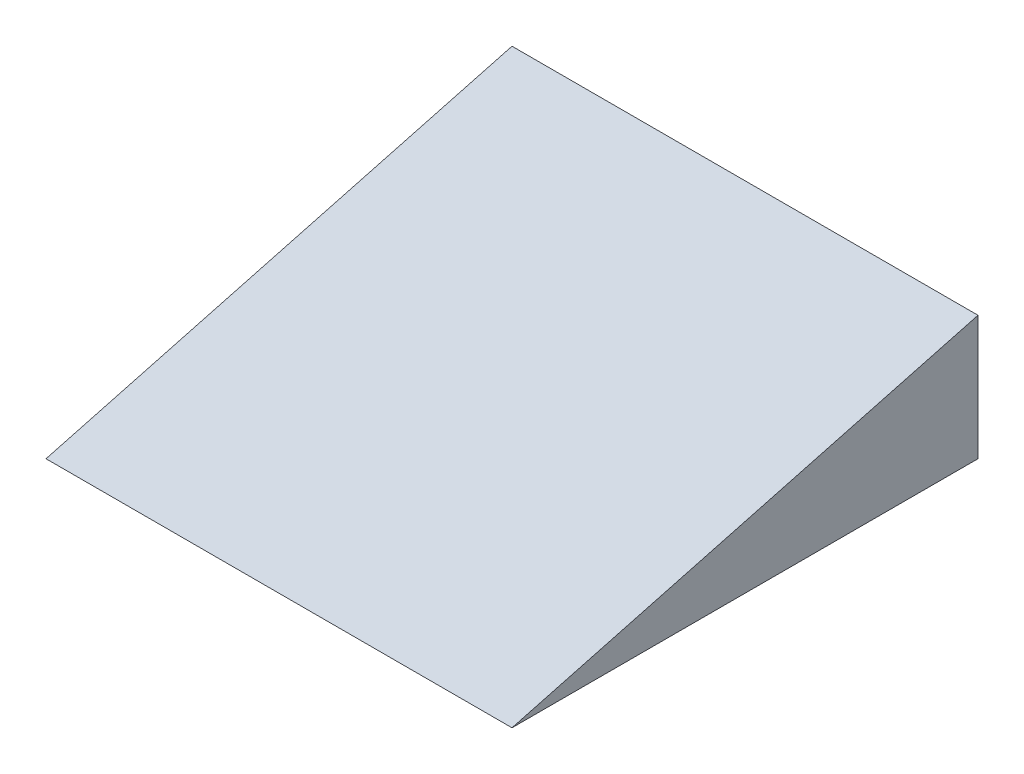
ISO-10303-21;
HEADER;
FILE_DESCRIPTION(('STEP AP214'),'2;1');
FILE_NAME('part.step','',(''),(''),'','','');
FILE_SCHEMA(('AUTOMOTIVE_DESIGN { 1 0 10303 214 1 1 1 1 }'));
ENDSEC;
DATA;
#1=APPLICATION_CONTEXT('core data for automotive mechanical design processes');
#2=APPLICATION_PROTOCOL_DEFINITION('international standard','automotive_design',2000,#1);
#3=PRODUCT_CONTEXT('',#1,'mechanical');
#4=PRODUCT('Part','Part','',(#3));
#5=PRODUCT_RELATED_PRODUCT_CATEGORY('part','',(#4));
#6=PRODUCT_DEFINITION_FORMATION('','',#4);
#7=PRODUCT_DEFINITION_CONTEXT('part definition',#1,'design');
#8=PRODUCT_DEFINITION('design','',#6,#7);
#9=PRODUCT_DEFINITION_SHAPE('','',#8);
#10=(LENGTH_UNIT() NAMED_UNIT(*) SI_UNIT(.MILLI.,.METRE.));
#11=(NAMED_UNIT(*) PLANE_ANGLE_UNIT() SI_UNIT($,.RADIAN.));
#12=(NAMED_UNIT(*) SI_UNIT($,.STERADIAN.) SOLID_ANGLE_UNIT());
#13=UNCERTAINTY_MEASURE_WITH_UNIT(LENGTH_MEASURE(1.E-05),#10,'distance_accuracy_value','');
#14=(GEOMETRIC_REPRESENTATION_CONTEXT(3) GLOBAL_UNCERTAINTY_ASSIGNED_CONTEXT((#13)) GLOBAL_UNIT_ASSIGNED_CONTEXT((#10,
#11,#12)) REPRESENTATION_CONTEXT('',''));
#15=CARTESIAN_POINT('',(0.,0.,0.));
#16=DIRECTION('',(0.,0.,1.));
#17=DIRECTION('',(1.,0.,0.));
#18=AXIS2_PLACEMENT_3D('',#15,#16,#17);
#19=CARTESIAN_POINT('',(1500.,400.,-1500.));
#20=DIRECTION('',(0.,-0.966234939601246,-0.257662650560332));
#21=DIRECTION('',(0.,0.257662650560332,-0.966234939601246));
#22=AXIS2_PLACEMENT_3D('',#19,#20,#21);
#23=PLANE('',#22);
#24=DIRECTION('',(0.,-0.257662650560332,0.966234939601246));
#25=VECTOR('',#24,1.);
#26=CARTESIAN_POINT('',(0.,400.,-1500.));
#27=LINE('',#26,#25);
#28=CARTESIAN_POINT('',(0.,400.,-1500.));
#29=VERTEX_POINT('',#28);
#30=CARTESIAN_POINT('',(0.,0.,0.));
#31=VERTEX_POINT('',#30);
#32=EDGE_CURVE('E86',#29,#31,#27,.T.);
#33=ORIENTED_EDGE('',*,*,#32,.T.);
#34=DIRECTION('',(-1.,0.,0.));
#35=VECTOR('',#34,1.);
#36=CARTESIAN_POINT('',(1500.,0.,0.));
#37=LINE('',#36,#35);
#38=CARTESIAN_POINT('',(1500.,0.,0.));
#39=VERTEX_POINT('',#38);
#40=EDGE_CURVE('E11',#39,#31,#37,.T.);
#41=ORIENTED_EDGE('',*,*,#40,.F.);
#42=DIRECTION('',(0.,-0.257662650560332,0.966234939601246));
#43=VECTOR('',#42,1.);
#44=CARTESIAN_POINT('',(1500.,400.,-1500.));
#45=LINE('',#44,#43);
#46=CARTESIAN_POINT('',(1500.,400.,-1500.));
#47=VERTEX_POINT('',#46);
#48=EDGE_CURVE('E82',#47,#39,#45,.T.);
#49=ORIENTED_EDGE('',*,*,#48,.F.);
#50=DIRECTION('',(-1.,0.,0.));
#51=VECTOR('',#50,1.);
#52=CARTESIAN_POINT('',(1500.,400.,-1500.));
#53=LINE('',#52,#51);
#54=EDGE_CURVE('E90',#47,#29,#53,.T.);
#55=ORIENTED_EDGE('',*,*,#54,.T.);
#56=EDGE_LOOP('',(#33,#41,#49,#55));
#57=FACE_BOUND('',#56,.T.);
#58=ADVANCED_FACE('F41',(#57),#23,.F.);
#59=CARTESIAN_POINT('',(1500.,0.,0.));
#60=DIRECTION('',(0.,1.,0.));
#61=DIRECTION('',(0.,0.,1.));
#62=AXIS2_PLACEMENT_3D('',#59,#60,#61);
#63=PLANE('',#62);
#64=DIRECTION('',(0.,0.,-1.));
#65=VECTOR('',#64,1.);
#66=CARTESIAN_POINT('',(0.,0.,0.));
#67=LINE('',#66,#65);
#68=CARTESIAN_POINT('',(0.,0.,-1500.));
#69=VERTEX_POINT('',#68);
#70=EDGE_CURVE('E66',#31,#69,#67,.T.);
#71=ORIENTED_EDGE('',*,*,#70,.T.);
#72=DIRECTION('',(-1.,0.,0.));
#73=VECTOR('',#72,1.);
#74=CARTESIAN_POINT('',(1500.,0.,-1500.));
#75=LINE('',#74,#73);
#76=CARTESIAN_POINT('',(1500.,0.,-1500.));
#77=VERTEX_POINT('',#76);
#78=EDGE_CURVE('E47',#77,#69,#75,.T.);
#79=ORIENTED_EDGE('',*,*,#78,.F.);
#80=DIRECTION('',(0.,0.,-1.));
#81=VECTOR('',#80,1.);
#82=CARTESIAN_POINT('',(1500.,0.,0.));
#83=LINE('',#82,#81);
#84=EDGE_CURVE('E80',#39,#77,#83,.T.);
#85=ORIENTED_EDGE('',*,*,#84,.F.);
#86=ORIENTED_EDGE('',*,*,#40,.T.);
#87=EDGE_LOOP('',(#71,#79,#85,#86));
#88=FACE_BOUND('',#87,.T.);
#89=ADVANCED_FACE('F77',(#88),#63,.F.);
#90=CARTESIAN_POINT('',(1500.,0.,-1500.));
#91=DIRECTION('',(0.,0.,1.));
#92=DIRECTION('',(1.,0.,0.));
#93=AXIS2_PLACEMENT_3D('',#90,#91,#92);
#94=PLANE('',#93);
#95=DIRECTION('',(0.,1.,0.));
#96=VECTOR('',#95,1.);
#97=CARTESIAN_POINT('',(0.,0.,-1500.));
#98=LINE('',#97,#96);
#99=EDGE_CURVE('E74',#69,#29,#98,.T.);
#100=ORIENTED_EDGE('',*,*,#99,.T.);
#101=ORIENTED_EDGE('',*,*,#54,.F.);
#102=DIRECTION('',(0.,1.,0.));
#103=VECTOR('',#102,1.);
#104=CARTESIAN_POINT('',(1500.,0.,-1500.));
#105=LINE('',#104,#103);
#106=EDGE_CURVE('E60',#77,#47,#105,.T.);
#107=ORIENTED_EDGE('',*,*,#106,.F.);
#108=ORIENTED_EDGE('',*,*,#78,.T.);
#109=EDGE_LOOP('',(#100,#101,#107,#108));
#110=FACE_BOUND('',#109,.T.);
#111=ADVANCED_FACE('F96',(#110),#94,.F.);
#112=CARTESIAN_POINT('',(1500.,0.,0.));
#113=DIRECTION('',(-1.,0.,0.));
#114=DIRECTION('',(0.,0.,1.));
#115=AXIS2_PLACEMENT_3D('',#112,#113,#114);
#116=PLANE('',#115);
#117=ORIENTED_EDGE('',*,*,#48,.T.);
#118=ORIENTED_EDGE('',*,*,#84,.T.);
#119=ORIENTED_EDGE('',*,*,#106,.T.);
#120=EDGE_LOOP('',(#117,#118,#119));
#121=FACE_BOUND('',#120,.T.);
#122=ADVANCED_FACE('F81',(#121),#116,.F.);
#123=CARTESIAN_POINT('',(0.,0.,0.));
#124=DIRECTION('',(-1.,0.,0.));
#125=DIRECTION('',(0.,0.,1.));
#126=AXIS2_PLACEMENT_3D('',#123,#124,#125);
#127=PLANE('',#126);
#128=ORIENTED_EDGE('',*,*,#32,.F.);
#129=ORIENTED_EDGE('',*,*,#99,.F.);
#130=ORIENTED_EDGE('',*,*,#70,.F.);
#131=EDGE_LOOP('',(#128,#129,#130));
#132=FACE_BOUND('',#131,.T.);
#133=ADVANCED_FACE('F100',(#132),#127,.T.);
#134=CLOSED_SHELL('',(#58,#89,#111,#122,#133));
#135=MANIFOLD_SOLID_BREP('B2',#134);
#136=ADVANCED_BREP_SHAPE_REPRESENTATION('',(#18,#135),#14);
#137=SHAPE_DEFINITION_REPRESENTATION(#9,#136);
ENDSEC;
END-ISO-10303-21;
